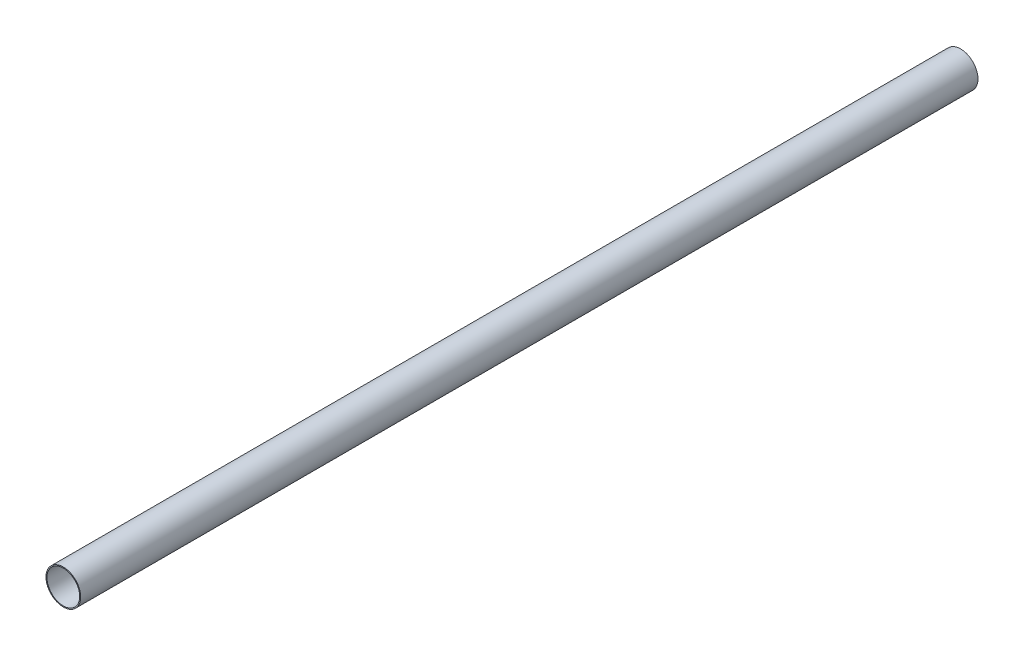
ISO-10303-21;
HEADER;
FILE_DESCRIPTION(('STEP AP214'),'2;1');
FILE_NAME('part.step','',(''),(''),'','','');
FILE_SCHEMA(('AUTOMOTIVE_DESIGN { 1 0 10303 214 1 1 1 1 }'));
ENDSEC;
DATA;
#1=APPLICATION_CONTEXT('core data for automotive mechanical design processes');
#2=APPLICATION_PROTOCOL_DEFINITION('international standard','automotive_design',2000,#1);
#3=PRODUCT_CONTEXT('',#1,'mechanical');
#4=PRODUCT('Part','Part','',(#3));
#5=PRODUCT_RELATED_PRODUCT_CATEGORY('part','',(#4));
#6=PRODUCT_DEFINITION_FORMATION('','',#4);
#7=PRODUCT_DEFINITION_CONTEXT('part definition',#1,'design');
#8=PRODUCT_DEFINITION('design','',#6,#7);
#9=PRODUCT_DEFINITION_SHAPE('','',#8);
#10=(LENGTH_UNIT() NAMED_UNIT(*) SI_UNIT(.MILLI.,.METRE.));
#11=(NAMED_UNIT(*) PLANE_ANGLE_UNIT() SI_UNIT($,.RADIAN.));
#12=(NAMED_UNIT(*) SI_UNIT($,.STERADIAN.) SOLID_ANGLE_UNIT());
#13=UNCERTAINTY_MEASURE_WITH_UNIT(LENGTH_MEASURE(1.E-05),#10,'distance_accuracy_value','');
#14=(GEOMETRIC_REPRESENTATION_CONTEXT(3) GLOBAL_UNCERTAINTY_ASSIGNED_CONTEXT((#13)) GLOBAL_UNIT_ASSIGNED_CONTEXT((#10,
#11,#12)) REPRESENTATION_CONTEXT('',''));
#15=CARTESIAN_POINT('',(0.,0.,0.));
#16=DIRECTION('',(0.,0.,1.));
#17=DIRECTION('',(1.,0.,0.));
#18=AXIS2_PLACEMENT_3D('',#15,#16,#17);
#19=CARTESIAN_POINT('',(0.,0.,1143.));
#20=DIRECTION('',(0.,0.,1.));
#21=DIRECTION('',(1.,0.,0.));
#22=AXIS2_PLACEMENT_3D('',#19,#20,#21);
#23=PLANE('',#22);
#24=CARTESIAN_POINT('',(0.,0.,1143.));
#25=DIRECTION('',(0.,0.,1.));
#26=DIRECTION('',(1.,0.,0.));
#27=AXIS2_PLACEMENT_3D('',#24,#25,#26);
#28=CIRCLE('',#27,22.1107);
#29=CARTESIAN_POINT('',(22.1107,0.,1143.));
#30=VERTEX_POINT('',#29);
#31=EDGE_CURVE('E10',#30,#30,#28,.T.);
#32=ORIENTED_EDGE('',*,*,#31,.T.);
#33=EDGE_LOOP('',(#32));
#34=FACE_BOUND('',#33,.T.);
#35=CARTESIAN_POINT('',(0.,0.,1143.));
#36=DIRECTION('',(0.,0.,1.));
#37=DIRECTION('',(1.,0.,0.));
#38=AXIS2_PLACEMENT_3D('',#35,#36,#37);
#39=CIRCLE('',#38,20.8407);
#40=CARTESIAN_POINT('',(20.8407,0.,1143.));
#41=VERTEX_POINT('',#40);
#42=EDGE_CURVE('E52',#41,#41,#39,.T.);
#43=ORIENTED_EDGE('',*,*,#42,.F.);
#44=EDGE_LOOP('',(#43));
#45=FACE_BOUND('',#44,.T.);
#46=ADVANCED_FACE('F38',(#34,#45),#23,.T.);
#47=CARTESIAN_POINT('',(0.,0.,0.));
#48=DIRECTION('',(0.,0.,1.));
#49=DIRECTION('',(1.,0.,0.));
#50=AXIS2_PLACEMENT_3D('',#47,#48,#49);
#51=PLANE('',#50);
#52=CARTESIAN_POINT('',(0.,0.,0.));
#53=DIRECTION('',(0.,0.,1.));
#54=DIRECTION('',(1.,0.,0.));
#55=AXIS2_PLACEMENT_3D('',#52,#53,#54);
#56=CIRCLE('',#55,22.1107);
#57=CARTESIAN_POINT('',(22.1107,0.,0.));
#58=VERTEX_POINT('',#57);
#59=EDGE_CURVE('E42',#58,#58,#56,.T.);
#60=ORIENTED_EDGE('',*,*,#59,.F.);
#61=EDGE_LOOP('',(#60));
#62=FACE_BOUND('',#61,.T.);
#63=CARTESIAN_POINT('',(0.,0.,0.));
#64=DIRECTION('',(0.,0.,1.));
#65=DIRECTION('',(1.,0.,0.));
#66=AXIS2_PLACEMENT_3D('',#63,#64,#65);
#67=CIRCLE('',#66,20.8407);
#68=CARTESIAN_POINT('',(20.8407,0.,0.));
#69=VERTEX_POINT('',#68);
#70=EDGE_CURVE('E54',#69,#69,#67,.T.);
#71=ORIENTED_EDGE('',*,*,#70,.T.);
#72=EDGE_LOOP('',(#71));
#73=FACE_BOUND('',#72,.T.);
#74=ADVANCED_FACE('F65',(#62,#73),#51,.F.);
#75=CARTESIAN_POINT('',(0.,0.,1143.));
#76=DIRECTION('',(0.,0.,-1.));
#77=DIRECTION('',(-1.,0.,0.));
#78=AXIS2_PLACEMENT_3D('',#75,#76,#77);
#79=CYLINDRICAL_SURFACE('',#78,22.1107);
#80=ORIENTED_EDGE('',*,*,#31,.F.);
#81=EDGE_LOOP('',(#80));
#82=FACE_BOUND('',#81,.T.);
#83=ORIENTED_EDGE('',*,*,#59,.T.);
#84=EDGE_LOOP('',(#83));
#85=FACE_BOUND('',#84,.T.);
#86=ADVANCED_FACE('F40',(#82,#85),#79,.T.);
#87=CARTESIAN_POINT('',(0.,0.,1143.));
#88=DIRECTION('',(0.,0.,-1.));
#89=DIRECTION('',(-1.,0.,0.));
#90=AXIS2_PLACEMENT_3D('',#87,#88,#89);
#91=CYLINDRICAL_SURFACE('',#90,20.8407);
#92=ORIENTED_EDGE('',*,*,#42,.T.);
#93=EDGE_LOOP('',(#92));
#94=FACE_BOUND('',#93,.T.);
#95=ORIENTED_EDGE('',*,*,#70,.F.);
#96=EDGE_LOOP('',(#95));
#97=FACE_BOUND('',#96,.T.);
#98=ADVANCED_FACE('F61',(#94,#97),#91,.F.);
#99=CLOSED_SHELL('',(#46,#74,#86,#98));
#100=MANIFOLD_SOLID_BREP('B2',#99);
#101=ADVANCED_BREP_SHAPE_REPRESENTATION('',(#18,#100),#14);
#102=SHAPE_DEFINITION_REPRESENTATION(#9,#101);
ENDSEC;
END-ISO-10303-21;
